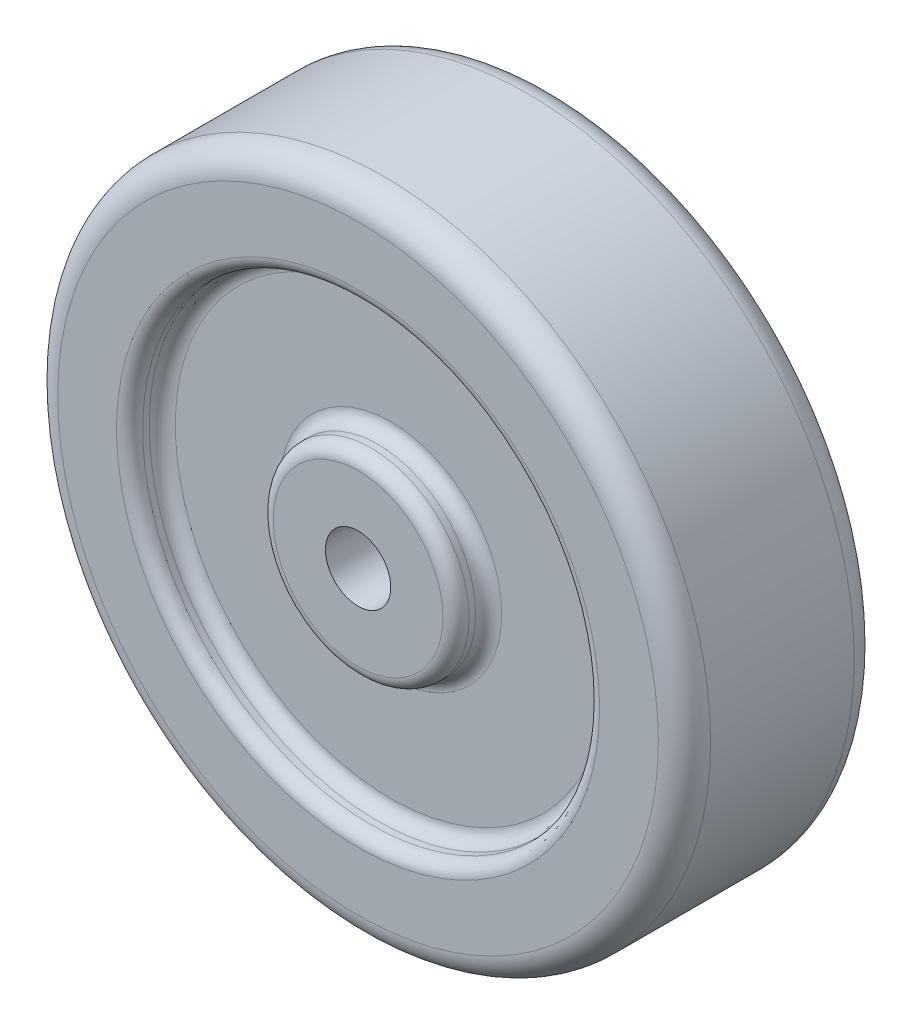
ISO-10303-21;
HEADER;
FILE_DESCRIPTION(('STEP AP214'),'2;1');
FILE_NAME('part.step','',(''),(''),'','','');
FILE_SCHEMA(('AUTOMOTIVE_DESIGN { 1 0 10303 214 1 1 1 1 }'));
ENDSEC;
DATA;
#1=APPLICATION_CONTEXT('core data for automotive mechanical design processes');
#2=APPLICATION_PROTOCOL_DEFINITION('international standard','automotive_design',2000,#1);
#3=PRODUCT_CONTEXT('',#1,'mechanical');
#4=PRODUCT('Part','Part','',(#3));
#5=PRODUCT_RELATED_PRODUCT_CATEGORY('part','',(#4));
#6=PRODUCT_DEFINITION_FORMATION('','',#4);
#7=PRODUCT_DEFINITION_CONTEXT('part definition',#1,'design');
#8=PRODUCT_DEFINITION('design','',#6,#7);
#9=PRODUCT_DEFINITION_SHAPE('','',#8);
#10=(LENGTH_UNIT() NAMED_UNIT(*) SI_UNIT(.MILLI.,.METRE.));
#11=(NAMED_UNIT(*) PLANE_ANGLE_UNIT() SI_UNIT($,.RADIAN.));
#12=(NAMED_UNIT(*) SI_UNIT($,.STERADIAN.) SOLID_ANGLE_UNIT());
#13=UNCERTAINTY_MEASURE_WITH_UNIT(LENGTH_MEASURE(1.E-05),#10,'distance_accuracy_value','');
#14=(GEOMETRIC_REPRESENTATION_CONTEXT(3) GLOBAL_UNCERTAINTY_ASSIGNED_CONTEXT((#13)) GLOBAL_UNIT_ASSIGNED_CONTEXT((#10,
#11,#12)) REPRESENTATION_CONTEXT('',''));
#15=CARTESIAN_POINT('',(0.,0.,0.));
#16=DIRECTION('',(0.,0.,1.));
#17=DIRECTION('',(1.,0.,0.));
#18=AXIS2_PLACEMENT_3D('',#15,#16,#17);
#19=CARTESIAN_POINT('',(0.,0.,9.525));
#20=DIRECTION('',(0.,0.,-1.));
#21=DIRECTION('',(-1.,0.,0.));
#22=AXIS2_PLACEMENT_3D('',#19,#20,#21);
#23=CYLINDRICAL_SURFACE('',#22,31.75);
#24=CARTESIAN_POINT('',(0.,0.,6.985));
#25=DIRECTION('',(0.,0.,1.));
#26=DIRECTION('',(1.,0.,0.));
#27=AXIS2_PLACEMENT_3D('',#24,#25,#26);
#28=CIRCLE('',#27,31.75);
#29=CARTESIAN_POINT('',(-31.75,0.,6.985));
#30=VERTEX_POINT('',#29);
#31=EDGE_CURVE('E64',#30,#30,#28,.F.);
#32=CARTESIAN_POINT('',(0.,0.,-6.985));
#33=DIRECTION('',(0.,0.,1.));
#34=DIRECTION('',(1.,0.,0.));
#35=AXIS2_PLACEMENT_3D('',#32,#33,#34);
#36=CIRCLE('',#35,31.75);
#37=CARTESIAN_POINT('',(-31.75,0.,-6.985));
#38=VERTEX_POINT('',#37);
#39=EDGE_CURVE('E94',#38,#38,#36,.F.);
#40=CARTESIAN_POINT('',(-31.75,0.,6.985));
#41=CARTESIAN_POINT('',(-31.75,0.,6.83947916666667));
#42=CARTESIAN_POINT('',(-31.75,0.,6.69395833333333));
#43=CARTESIAN_POINT('',(-31.75,0.,6.40291666666667));
#44=CARTESIAN_POINT('',(-31.75,0.,6.25739583333333));
#45=CARTESIAN_POINT('',(-31.75,0.,5.96635416666667));
#46=CARTESIAN_POINT('',(-31.75,0.,5.82083333333333));
#47=CARTESIAN_POINT('',(-31.75,0.,5.52979166666667));
#48=CARTESIAN_POINT('',(-31.75,0.,5.38427083333333));
#49=CARTESIAN_POINT('',(-31.75,0.,5.09322916666667));
#50=CARTESIAN_POINT('',(-31.75,0.,4.94770833333333));
#51=CARTESIAN_POINT('',(-31.75,0.,4.65666666666667));
#52=CARTESIAN_POINT('',(-31.75,0.,4.51114583333333));
#53=CARTESIAN_POINT('',(-31.75,0.,4.22010416666667));
#54=CARTESIAN_POINT('',(-31.75,0.,4.07458333333333));
#55=CARTESIAN_POINT('',(-31.75,0.,3.78354166666667));
#56=CARTESIAN_POINT('',(-31.75,0.,3.63802083333333));
#57=CARTESIAN_POINT('',(-31.75,0.,3.34697916666667));
#58=CARTESIAN_POINT('',(-31.75,0.,3.20145833333333));
#59=CARTESIAN_POINT('',(-31.75,0.,2.91041666666667));
#60=CARTESIAN_POINT('',(-31.75,0.,2.76489583333333));
#61=CARTESIAN_POINT('',(-31.75,0.,2.47385416666667));
#62=CARTESIAN_POINT('',(-31.75,0.,2.32833333333333));
#63=CARTESIAN_POINT('',(-31.75,0.,2.03729166666667));
#64=CARTESIAN_POINT('',(-31.75,0.,1.89177083333333));
#65=CARTESIAN_POINT('',(-31.75,0.,1.60072916666667));
#66=CARTESIAN_POINT('',(-31.75,0.,1.45520833333333));
#67=CARTESIAN_POINT('',(-31.75,0.,1.16416666666667));
#68=CARTESIAN_POINT('',(-31.75,0.,1.01864583333333));
#69=CARTESIAN_POINT('',(-31.75,0.,0.727604166666666));
#70=CARTESIAN_POINT('',(-31.75,0.,0.582083333333333));
#71=CARTESIAN_POINT('',(-31.75,0.,0.291041666666666));
#72=CARTESIAN_POINT('',(-31.75,0.,0.145520833333333));
#73=CARTESIAN_POINT('',(-31.75,0.,-0.145520833333334));
#74=CARTESIAN_POINT('',(-31.75,0.,-0.291041666666667));
#75=CARTESIAN_POINT('',(-31.75,0.,-0.582083333333335));
#76=CARTESIAN_POINT('',(-31.75,0.,-0.727604166666669));
#77=CARTESIAN_POINT('',(-31.75,0.,-1.01864583333334));
#78=CARTESIAN_POINT('',(-31.75,0.,-1.16416666666667));
#79=CARTESIAN_POINT('',(-31.75,0.,-1.45520833333333));
#80=CARTESIAN_POINT('',(-31.75,0.,-1.60072916666667));
#81=CARTESIAN_POINT('',(-31.75,0.,-1.89177083333334));
#82=CARTESIAN_POINT('',(-31.75,0.,-2.03729166666667));
#83=CARTESIAN_POINT('',(-31.75,0.,-2.32833333333333));
#84=CARTESIAN_POINT('',(-31.75,0.,-2.47385416666667));
#85=CARTESIAN_POINT('',(-31.75,0.,-2.76489583333333));
#86=CARTESIAN_POINT('',(-31.75,0.,-2.91041666666667));
#87=CARTESIAN_POINT('',(-31.75,0.,-3.20145833333334));
#88=CARTESIAN_POINT('',(-31.75,0.,-3.34697916666667));
#89=CARTESIAN_POINT('',(-31.75,0.,-3.63802083333334));
#90=CARTESIAN_POINT('',(-31.75,0.,-3.78354166666667));
#91=CARTESIAN_POINT('',(-31.75,0.,-4.07458333333333));
#92=CARTESIAN_POINT('',(-31.75,0.,-4.22010416666667));
#93=CARTESIAN_POINT('',(-31.75,0.,-4.51114583333333));
#94=CARTESIAN_POINT('',(-31.75,0.,-4.65666666666667));
#95=CARTESIAN_POINT('',(-31.75,0.,-4.94770833333334));
#96=CARTESIAN_POINT('',(-31.75,0.,-5.09322916666667));
#97=CARTESIAN_POINT('',(-31.75,0.,-5.38427083333333));
#98=CARTESIAN_POINT('',(-31.75,0.,-5.52979166666667));
#99=CARTESIAN_POINT('',(-31.75,0.,-5.82083333333333));
#100=CARTESIAN_POINT('',(-31.75,0.,-5.96635416666667));
#101=CARTESIAN_POINT('',(-31.75,0.,-6.25739583333333));
#102=CARTESIAN_POINT('',(-31.75,0.,-6.40291666666667));
#103=CARTESIAN_POINT('',(-31.75,0.,-6.69395833333333));
#104=CARTESIAN_POINT('',(-31.75,0.,-6.83947916666667));
#105=CARTESIAN_POINT('',(-31.75,0.,-6.985));
#106=B_SPLINE_CURVE_WITH_KNOTS('',3,(#40,#41,#42,#43,#44,#45,#46,#47,#48,#49,#50,#51,#52,#53,
#54,#55,#56,#57,#58,#59,#60,#61,#62,#63,#64,#65,#66,#67,#68,#69,#70,#71,#72,#73,#74,#75,#76,#77,
#78,#79,#80,#81,#82,#83,#84,#85,#86,#87,#88,#89,#90,#91,#92,#93,#94,#95,#96,#97,#98,#99,#100,
#101,#102,#103,#104,#105),.UNSPECIFIED.,.F.,.F.,(4,2,2,2,2,2,2,2,2,2,2,2,2,2,2,2,2,2,2,2,2,2,2,
2,2,2,2,2,2,2,2,2,4),(0.,0.436562500000001,0.873125000000001,1.3096875,1.74625,2.1828125,
2.619375,3.0559375,3.4925,3.9290625,4.365625,4.8021875,5.23875,5.6753125,6.111875,6.5484375,
6.985,7.4215625,7.858125,8.2946875,8.73125,9.1678125,9.604375,10.0409375,10.4775,10.9140625,
11.350625,11.7871875,12.22375,12.6603125,13.096875,13.5334375,13.97),.UNSPECIFIED.);
#107=EDGE_CURVE('BSEAM32',#30,#38,#106,.T.);
#108=ORIENTED_EDGE('',*,*,#31,.T.);
#109=ORIENTED_EDGE('',*,*,#39,.F.);
#110=ORIENTED_EDGE('',*,*,#107,.T.);
#111=ORIENTED_EDGE('',*,*,#107,.F.);
#112=EDGE_LOOP('',(#108,#110,#109,#111));
#113=FACE_BOUND('',#112,.T.);
#114=ADVANCED_FACE('F32',(#113),#23,.T.);
#115=CARTESIAN_POINT('',(0.,0.,9.525));
#116=DIRECTION('',(0.,0.,1.));
#117=DIRECTION('',(1.,0.,0.));
#118=AXIS2_PLACEMENT_3D('',#115,#116,#117);
#119=PLANE('',#118);
#120=CARTESIAN_POINT('',(0.,0.,9.525));
#121=DIRECTION('',(0.,0.,1.));
#122=DIRECTION('',(1.,0.,0.));
#123=AXIS2_PLACEMENT_3D('',#120,#121,#122);
#124=CIRCLE('',#123,23.495);
#125=CARTESIAN_POINT('',(23.495,0.,9.525));
#126=VERTEX_POINT('',#125);
#127=EDGE_CURVE('E10',#126,#126,#124,.F.);
#128=ORIENTED_EDGE('',*,*,#127,.T.);
#129=EDGE_LOOP('',(#128));
#130=FACE_BOUND('',#129,.T.);
#131=CARTESIAN_POINT('',(0.,0.,9.525));
#132=DIRECTION('',(0.,0.,1.));
#133=DIRECTION('',(1.,0.,0.));
#134=AXIS2_PLACEMENT_3D('',#131,#132,#133);
#135=CIRCLE('',#134,29.21);
#136=CARTESIAN_POINT('',(29.21,0.,9.525));
#137=VERTEX_POINT('',#136);
#138=EDGE_CURVE('E67',#137,#137,#135,.T.);
#139=ORIENTED_EDGE('',*,*,#138,.T.);
#140=EDGE_LOOP('',(#139));
#141=FACE_BOUND('',#140,.T.);
#142=ADVANCED_FACE('F123',(#130,#141),#119,.T.);
#143=CARTESIAN_POINT('',(0.,0.,6.985));
#144=DIRECTION('',(0.,0.,1.));
#145=DIRECTION('',(1.,0.,0.));
#146=AXIS2_PLACEMENT_3D('',#143,#144,#145);
#147=TOROIDAL_SURFACE('',#146,29.21,2.54);
#148=ORIENTED_EDGE('',*,*,#31,.F.);
#149=EDGE_LOOP('',(#148));
#150=FACE_BOUND('',#149,.T.);
#151=ORIENTED_EDGE('',*,*,#138,.F.);
#152=EDGE_LOOP('',(#151));
#153=FACE_BOUND('',#152,.T.);
#154=ADVANCED_FACE('F145',(#150,#153),#147,.T.);
#155=CARTESIAN_POINT('',(0.,0.,6.35));
#156=DIRECTION('',(0.,0.,1.));
#157=DIRECTION('',(1.,0.,0.));
#158=AXIS2_PLACEMENT_3D('',#155,#156,#157);
#159=CYLINDRICAL_SURFACE('',#158,22.225);
#160=CARTESIAN_POINT('',(0.,0.,7.62));
#161=DIRECTION('',(0.,0.,1.));
#162=DIRECTION('',(1.,0.,0.));
#163=AXIS2_PLACEMENT_3D('',#160,#161,#162);
#164=CIRCLE('',#163,22.225);
#165=CARTESIAN_POINT('',(22.225,0.,7.62));
#166=VERTEX_POINT('',#165);
#167=EDGE_CURVE('E39',#166,#166,#164,.F.);
#168=ORIENTED_EDGE('',*,*,#167,.T.);
#169=EDGE_LOOP('',(#168));
#170=FACE_BOUND('',#169,.T.);
#171=CARTESIAN_POINT('',(0.,0.,8.255));
#172=DIRECTION('',(0.,0.,1.));
#173=DIRECTION('',(1.,0.,0.));
#174=AXIS2_PLACEMENT_3D('',#171,#172,#173);
#175=CIRCLE('',#174,22.225);
#176=CARTESIAN_POINT('',(22.225,0.,8.255));
#177=VERTEX_POINT('',#176);
#178=EDGE_CURVE('E43',#177,#177,#175,.T.);
#179=ORIENTED_EDGE('',*,*,#178,.T.);
#180=EDGE_LOOP('',(#179));
#181=FACE_BOUND('',#180,.T.);
#182=ADVANCED_FACE('F150',(#170,#181),#159,.F.);
#183=CARTESIAN_POINT('',(0.,0.,6.35));
#184=DIRECTION('',(0.,0.,1.));
#185=DIRECTION('',(1.,0.,0.));
#186=AXIS2_PLACEMENT_3D('',#183,#184,#185);
#187=PLANE('',#186);
#188=CARTESIAN_POINT('',(0.,0.,6.35));
#189=DIRECTION('',(0.,0.,1.));
#190=DIRECTION('',(1.,0.,0.));
#191=AXIS2_PLACEMENT_3D('',#188,#189,#190);
#192=CIRCLE('',#191,10.795);
#193=CARTESIAN_POINT('',(10.795,0.,6.35));
#194=VERTEX_POINT('',#193);
#195=EDGE_CURVE('E52',#194,#194,#192,.F.);
#196=ORIENTED_EDGE('',*,*,#195,.T.);
#197=EDGE_LOOP('',(#196));
#198=FACE_BOUND('',#197,.T.);
#199=CARTESIAN_POINT('',(0.,0.,6.35));
#200=DIRECTION('',(0.,0.,1.));
#201=DIRECTION('',(1.,0.,0.));
#202=AXIS2_PLACEMENT_3D('',#199,#200,#201);
#203=CIRCLE('',#202,20.955);
#204=CARTESIAN_POINT('',(20.955,0.,6.35));
#205=VERTEX_POINT('',#204);
#206=EDGE_CURVE('E55',#205,#205,#203,.T.);
#207=ORIENTED_EDGE('',*,*,#206,.T.);
#208=EDGE_LOOP('',(#207));
#209=FACE_BOUND('',#208,.T.);
#210=ADVANCED_FACE('F155',(#198,#209),#187,.T.);
#211=CARTESIAN_POINT('',(0.,0.,6.35));
#212=DIRECTION('',(0.,0.,1.));
#213=DIRECTION('',(1.,0.,0.));
#214=AXIS2_PLACEMENT_3D('',#211,#212,#213);
#215=CYLINDRICAL_SURFACE('',#214,9.525);
#216=CARTESIAN_POINT('',(0.,0.,7.62));
#217=DIRECTION('',(0.,0.,1.));
#218=DIRECTION('',(1.,0.,0.));
#219=AXIS2_PLACEMENT_3D('',#216,#217,#218);
#220=CIRCLE('',#219,9.525);
#221=CARTESIAN_POINT('',(9.525,0.,7.62));
#222=VERTEX_POINT('',#221);
#223=EDGE_CURVE('E58',#222,#222,#220,.T.);
#224=ORIENTED_EDGE('',*,*,#223,.T.);
#225=EDGE_LOOP('',(#224));
#226=FACE_BOUND('',#225,.T.);
#227=CARTESIAN_POINT('',(0.,0.,8.255));
#228=DIRECTION('',(0.,0.,1.));
#229=DIRECTION('',(1.,0.,0.));
#230=AXIS2_PLACEMENT_3D('',#227,#228,#229);
#231=CIRCLE('',#230,9.525);
#232=CARTESIAN_POINT('',(9.525,0.,8.255));
#233=VERTEX_POINT('',#232);
#234=EDGE_CURVE('E61',#233,#233,#231,.F.);
#235=ORIENTED_EDGE('',*,*,#234,.T.);
#236=EDGE_LOOP('',(#235));
#237=FACE_BOUND('',#236,.T.);
#238=ADVANCED_FACE('F121',(#226,#237),#215,.T.);
#239=CARTESIAN_POINT('',(0.,0.,9.525));
#240=DIRECTION('',(0.,0.,1.));
#241=DIRECTION('',(1.,0.,0.));
#242=AXIS2_PLACEMENT_3D('',#239,#240,#241);
#243=CIRCLE('',#242,3.175);
#244=CARTESIAN_POINT('',(3.175,0.,9.525));
#245=VERTEX_POINT('',#244);
#246=EDGE_CURVE('E101',#245,#245,#243,.T.);
#247=ORIENTED_EDGE('',*,*,#246,.F.);
#248=EDGE_LOOP('',(#247));
#249=FACE_BOUND('',#248,.T.);
#250=CARTESIAN_POINT('',(0.,0.,9.525));
#251=DIRECTION('',(0.,0.,1.));
#252=DIRECTION('',(1.,0.,0.));
#253=AXIS2_PLACEMENT_3D('',#250,#251,#252);
#254=CIRCLE('',#253,8.255);
#255=CARTESIAN_POINT('',(8.255,0.,9.525));
#256=VERTEX_POINT('',#255);
#257=EDGE_CURVE('E47',#256,#256,#254,.T.);
#258=ORIENTED_EDGE('',*,*,#257,.T.);
#259=EDGE_LOOP('',(#258));
#260=FACE_BOUND('',#259,.T.);
#261=ADVANCED_FACE('F117',(#249,#260),#119,.T.);
#262=CARTESIAN_POINT('',(0.,0.,7.62));
#263=DIRECTION('',(0.,0.,1.));
#264=DIRECTION('',(1.,0.,0.));
#265=AXIS2_PLACEMENT_3D('',#262,#263,#264);
#266=TOROIDAL_SURFACE('',#265,10.795,1.27);
#267=ORIENTED_EDGE('',*,*,#195,.F.);
#268=EDGE_LOOP('',(#267));
#269=FACE_BOUND('',#268,.T.);
#270=ORIENTED_EDGE('',*,*,#223,.F.);
#271=EDGE_LOOP('',(#270));
#272=FACE_BOUND('',#271,.T.);
#273=ADVANCED_FACE('F120',(#269,#272),#266,.F.);
#274=CARTESIAN_POINT('',(0.,0.,8.255));
#275=DIRECTION('',(0.,0.,1.));
#276=DIRECTION('',(1.,0.,0.));
#277=AXIS2_PLACEMENT_3D('',#274,#275,#276);
#278=TOROIDAL_SURFACE('',#277,8.255,1.27);
#279=ORIENTED_EDGE('',*,*,#234,.F.);
#280=EDGE_LOOP('',(#279));
#281=FACE_BOUND('',#280,.T.);
#282=ORIENTED_EDGE('',*,*,#257,.F.);
#283=EDGE_LOOP('',(#282));
#284=FACE_BOUND('',#283,.T.);
#285=ADVANCED_FACE('F126',(#281,#284),#278,.T.);
#286=CARTESIAN_POINT('',(0.,0.,7.62));
#287=DIRECTION('',(0.,0.,1.));
#288=DIRECTION('',(1.,0.,0.));
#289=AXIS2_PLACEMENT_3D('',#286,#287,#288);
#290=TOROIDAL_SURFACE('',#289,20.955,1.27);
#291=ORIENTED_EDGE('',*,*,#167,.F.);
#292=EDGE_LOOP('',(#291));
#293=FACE_BOUND('',#292,.T.);
#294=ORIENTED_EDGE('',*,*,#206,.F.);
#295=EDGE_LOOP('',(#294));
#296=FACE_BOUND('',#295,.T.);
#297=ADVANCED_FACE('F128',(#293,#296),#290,.F.);
#298=CARTESIAN_POINT('',(0.,0.,8.255));
#299=DIRECTION('',(0.,0.,1.));
#300=DIRECTION('',(1.,0.,0.));
#301=AXIS2_PLACEMENT_3D('',#298,#299,#300);
#302=TOROIDAL_SURFACE('',#301,23.495,1.27);
#303=ORIENTED_EDGE('',*,*,#127,.F.);
#304=EDGE_LOOP('',(#303));
#305=FACE_BOUND('',#304,.T.);
#306=ORIENTED_EDGE('',*,*,#178,.F.);
#307=EDGE_LOOP('',(#306));
#308=FACE_BOUND('',#307,.T.);
#309=ADVANCED_FACE('F34',(#305,#308),#302,.T.);
#310=CARTESIAN_POINT('',(0.,0.,-9.525));
#311=DIRECTION('',(0.,0.,-1.));
#312=DIRECTION('',(1.,0.,0.));
#313=AXIS2_PLACEMENT_3D('',#310,#311,#312);
#314=PLANE('',#313);
#315=CARTESIAN_POINT('',(0.,0.,-9.525));
#316=DIRECTION('',(0.,0.,1.));
#317=DIRECTION('',(1.,0.,0.));
#318=AXIS2_PLACEMENT_3D('',#315,#316,#317);
#319=CIRCLE('',#318,23.495);
#320=CARTESIAN_POINT('',(23.495,0.,-9.525));
#321=VERTEX_POINT('',#320);
#322=EDGE_CURVE('E70',#321,#321,#319,.F.);
#323=ORIENTED_EDGE('',*,*,#322,.F.);
#324=EDGE_LOOP('',(#323));
#325=FACE_BOUND('',#324,.T.);
#326=CARTESIAN_POINT('',(0.,0.,-9.525));
#327=DIRECTION('',(0.,0.,1.));
#328=DIRECTION('',(1.,0.,0.));
#329=AXIS2_PLACEMENT_3D('',#326,#327,#328);
#330=CIRCLE('',#329,29.21);
#331=CARTESIAN_POINT('',(29.21,0.,-9.525));
#332=VERTEX_POINT('',#331);
#333=EDGE_CURVE('E97',#332,#332,#330,.T.);
#334=ORIENTED_EDGE('',*,*,#333,.F.);
#335=EDGE_LOOP('',(#334));
#336=FACE_BOUND('',#335,.T.);
#337=ADVANCED_FACE('F189',(#325,#336),#314,.T.);
#338=CARTESIAN_POINT('',(0.,0.,-6.985));
#339=DIRECTION('',(0.,0.,-1.));
#340=DIRECTION('',(1.,0.,0.));
#341=AXIS2_PLACEMENT_3D('',#338,#339,#340);
#342=TOROIDAL_SURFACE('',#341,29.21,2.54);
#343=ORIENTED_EDGE('',*,*,#39,.T.);
#344=EDGE_LOOP('',(#343));
#345=FACE_BOUND('',#344,.T.);
#346=ORIENTED_EDGE('',*,*,#333,.T.);
#347=EDGE_LOOP('',(#346));
#348=FACE_BOUND('',#347,.T.);
#349=ADVANCED_FACE('F185',(#345,#348),#342,.T.);
#350=CARTESIAN_POINT('',(0.,0.,-6.35));
#351=DIRECTION('',(0.,0.,-1.));
#352=DIRECTION('',(1.,0.,0.));
#353=AXIS2_PLACEMENT_3D('',#350,#351,#352);
#354=CYLINDRICAL_SURFACE('',#353,22.225);
#355=CARTESIAN_POINT('',(0.,0.,-7.62));
#356=DIRECTION('',(0.,0.,1.));
#357=DIRECTION('',(1.,0.,0.));
#358=AXIS2_PLACEMENT_3D('',#355,#356,#357);
#359=CIRCLE('',#358,22.225);
#360=CARTESIAN_POINT('',(22.225,0.,-7.62));
#361=VERTEX_POINT('',#360);
#362=EDGE_CURVE('E73',#361,#361,#359,.F.);
#363=ORIENTED_EDGE('',*,*,#362,.F.);
#364=EDGE_LOOP('',(#363));
#365=FACE_BOUND('',#364,.T.);
#366=CARTESIAN_POINT('',(0.,0.,-8.255));
#367=DIRECTION('',(0.,0.,1.));
#368=DIRECTION('',(1.,0.,0.));
#369=AXIS2_PLACEMENT_3D('',#366,#367,#368);
#370=CIRCLE('',#369,22.225);
#371=CARTESIAN_POINT('',(22.225,0.,-8.255));
#372=VERTEX_POINT('',#371);
#373=EDGE_CURVE('E76',#372,#372,#370,.T.);
#374=ORIENTED_EDGE('',*,*,#373,.F.);
#375=EDGE_LOOP('',(#374));
#376=FACE_BOUND('',#375,.T.);
#377=ADVANCED_FACE('F188',(#365,#376),#354,.F.);
#378=CARTESIAN_POINT('',(0.,0.,-6.35));
#379=DIRECTION('',(0.,0.,-1.));
#380=DIRECTION('',(1.,0.,0.));
#381=AXIS2_PLACEMENT_3D('',#378,#379,#380);
#382=PLANE('',#381);
#383=CARTESIAN_POINT('',(0.,0.,-6.35));
#384=DIRECTION('',(0.,0.,1.));
#385=DIRECTION('',(1.,0.,0.));
#386=AXIS2_PLACEMENT_3D('',#383,#384,#385);
#387=CIRCLE('',#386,10.795);
#388=CARTESIAN_POINT('',(10.795,0.,-6.35));
#389=VERTEX_POINT('',#388);
#390=EDGE_CURVE('E82',#389,#389,#387,.F.);
#391=ORIENTED_EDGE('',*,*,#390,.F.);
#392=EDGE_LOOP('',(#391));
#393=FACE_BOUND('',#392,.T.);
#394=CARTESIAN_POINT('',(0.,0.,-6.35));
#395=DIRECTION('',(0.,0.,1.));
#396=DIRECTION('',(1.,0.,0.));
#397=AXIS2_PLACEMENT_3D('',#394,#395,#396);
#398=CIRCLE('',#397,20.955);
#399=CARTESIAN_POINT('',(20.955,0.,-6.35));
#400=VERTEX_POINT('',#399);
#401=EDGE_CURVE('E85',#400,#400,#398,.T.);
#402=ORIENTED_EDGE('',*,*,#401,.F.);
#403=EDGE_LOOP('',(#402));
#404=FACE_BOUND('',#403,.T.);
#405=ADVANCED_FACE('F196',(#393,#404),#382,.T.);
#406=CARTESIAN_POINT('',(0.,0.,-6.35));
#407=DIRECTION('',(0.,0.,-1.));
#408=DIRECTION('',(1.,0.,0.));
#409=AXIS2_PLACEMENT_3D('',#406,#407,#408);
#410=CYLINDRICAL_SURFACE('',#409,9.525);
#411=CARTESIAN_POINT('',(0.,0.,-7.62));
#412=DIRECTION('',(0.,0.,1.));
#413=DIRECTION('',(1.,0.,0.));
#414=AXIS2_PLACEMENT_3D('',#411,#412,#413);
#415=CIRCLE('',#414,9.525);
#416=CARTESIAN_POINT('',(9.525,0.,-7.62));
#417=VERTEX_POINT('',#416);
#418=EDGE_CURVE('E88',#417,#417,#415,.T.);
#419=ORIENTED_EDGE('',*,*,#418,.F.);
#420=EDGE_LOOP('',(#419));
#421=FACE_BOUND('',#420,.T.);
#422=CARTESIAN_POINT('',(0.,0.,-8.255));
#423=DIRECTION('',(0.,0.,1.));
#424=DIRECTION('',(1.,0.,0.));
#425=AXIS2_PLACEMENT_3D('',#422,#423,#424);
#426=CIRCLE('',#425,9.525);
#427=CARTESIAN_POINT('',(9.525,0.,-8.255));
#428=VERTEX_POINT('',#427);
#429=EDGE_CURVE('E91',#428,#428,#426,.F.);
#430=ORIENTED_EDGE('',*,*,#429,.F.);
#431=EDGE_LOOP('',(#430));
#432=FACE_BOUND('',#431,.T.);
#433=ADVANCED_FACE('F200',(#421,#432),#410,.T.);
#434=CARTESIAN_POINT('',(0.,0.,-9.525));
#435=DIRECTION('',(0.,0.,1.));
#436=DIRECTION('',(1.,0.,0.));
#437=AXIS2_PLACEMENT_3D('',#434,#435,#436);
#438=CIRCLE('',#437,3.175);
#439=CARTESIAN_POINT('',(3.175,0.,-9.525));
#440=VERTEX_POINT('',#439);
#441=EDGE_CURVE('E100',#440,#440,#438,.T.);
#442=ORIENTED_EDGE('',*,*,#441,.T.);
#443=EDGE_LOOP('',(#442));
#444=FACE_BOUND('',#443,.T.);
#445=CARTESIAN_POINT('',(0.,0.,-9.525));
#446=DIRECTION('',(0.,0.,1.));
#447=DIRECTION('',(1.,0.,0.));
#448=AXIS2_PLACEMENT_3D('',#445,#446,#447);
#449=CIRCLE('',#448,8.255);
#450=CARTESIAN_POINT('',(8.255,0.,-9.525));
#451=VERTEX_POINT('',#450);
#452=EDGE_CURVE('E79',#451,#451,#449,.T.);
#453=ORIENTED_EDGE('',*,*,#452,.F.);
#454=EDGE_LOOP('',(#453));
#455=FACE_BOUND('',#454,.T.);
#456=ADVANCED_FACE('F107',(#444,#455),#314,.T.);
#457=CARTESIAN_POINT('',(0.,0.,-7.62));
#458=DIRECTION('',(0.,0.,-1.));
#459=DIRECTION('',(1.,0.,0.));
#460=AXIS2_PLACEMENT_3D('',#457,#458,#459);
#461=TOROIDAL_SURFACE('',#460,10.795,1.27);
#462=ORIENTED_EDGE('',*,*,#390,.T.);
#463=EDGE_LOOP('',(#462));
#464=FACE_BOUND('',#463,.T.);
#465=ORIENTED_EDGE('',*,*,#418,.T.);
#466=EDGE_LOOP('',(#465));
#467=FACE_BOUND('',#466,.T.);
#468=ADVANCED_FACE('F180',(#464,#467),#461,.F.);
#469=CARTESIAN_POINT('',(0.,0.,-8.255));
#470=DIRECTION('',(0.,0.,-1.));
#471=DIRECTION('',(1.,0.,0.));
#472=AXIS2_PLACEMENT_3D('',#469,#470,#471);
#473=TOROIDAL_SURFACE('',#472,8.255,1.27);
#474=ORIENTED_EDGE('',*,*,#429,.T.);
#475=EDGE_LOOP('',(#474));
#476=FACE_BOUND('',#475,.T.);
#477=ORIENTED_EDGE('',*,*,#452,.T.);
#478=EDGE_LOOP('',(#477));
#479=FACE_BOUND('',#478,.T.);
#480=ADVANCED_FACE('F176',(#476,#479),#473,.T.);
#481=CARTESIAN_POINT('',(0.,0.,-7.62));
#482=DIRECTION('',(0.,0.,-1.));
#483=DIRECTION('',(1.,0.,0.));
#484=AXIS2_PLACEMENT_3D('',#481,#482,#483);
#485=TOROIDAL_SURFACE('',#484,20.955,1.27);
#486=ORIENTED_EDGE('',*,*,#362,.T.);
#487=EDGE_LOOP('',(#486));
#488=FACE_BOUND('',#487,.T.);
#489=ORIENTED_EDGE('',*,*,#401,.T.);
#490=EDGE_LOOP('',(#489));
#491=FACE_BOUND('',#490,.T.);
#492=ADVANCED_FACE('F172',(#488,#491),#485,.F.);
#493=CARTESIAN_POINT('',(0.,0.,-8.255));
#494=DIRECTION('',(0.,0.,-1.));
#495=DIRECTION('',(1.,0.,0.));
#496=AXIS2_PLACEMENT_3D('',#493,#494,#495);
#497=TOROIDAL_SURFACE('',#496,23.495,1.27);
#498=ORIENTED_EDGE('',*,*,#322,.T.);
#499=EDGE_LOOP('',(#498));
#500=FACE_BOUND('',#499,.T.);
#501=ORIENTED_EDGE('',*,*,#373,.T.);
#502=EDGE_LOOP('',(#501));
#503=FACE_BOUND('',#502,.T.);
#504=ADVANCED_FACE('F113',(#500,#503),#497,.T.);
#505=CARTESIAN_POINT('',(0.,0.,-9.525));
#506=DIRECTION('',(0.,0.,1.));
#507=DIRECTION('',(1.,0.,0.));
#508=AXIS2_PLACEMENT_3D('',#505,#506,#507);
#509=CYLINDRICAL_SURFACE('',#508,3.175);
#510=CARTESIAN_POINT('',(3.175,0.,-9.525));
#511=CARTESIAN_POINT('',(3.175,0.,-9.3265625));
#512=CARTESIAN_POINT('',(3.175,0.,-9.128125));
#513=CARTESIAN_POINT('',(3.175,0.,-8.73125));
#514=CARTESIAN_POINT('',(3.175,0.,-8.5328125));
#515=CARTESIAN_POINT('',(3.175,0.,-8.1359375));
#516=CARTESIAN_POINT('',(3.175,0.,-7.9375));
#517=CARTESIAN_POINT('',(3.175,0.,-7.540625));
#518=CARTESIAN_POINT('',(3.175,0.,-7.3421875));
#519=CARTESIAN_POINT('',(3.175,0.,-6.9453125));
#520=CARTESIAN_POINT('',(3.175,0.,-6.746875));
#521=CARTESIAN_POINT('',(3.175,0.,-6.35));
#522=CARTESIAN_POINT('',(3.175,0.,-6.1515625));
#523=CARTESIAN_POINT('',(3.175,0.,-5.7546875));
#524=CARTESIAN_POINT('',(3.175,0.,-5.55625));
#525=CARTESIAN_POINT('',(3.175,0.,-5.159375));
#526=CARTESIAN_POINT('',(3.175,0.,-4.9609375));
#527=CARTESIAN_POINT('',(3.175,0.,-4.5640625));
#528=CARTESIAN_POINT('',(3.175,0.,-4.365625));
#529=CARTESIAN_POINT('',(3.175,0.,-3.96875));
#530=CARTESIAN_POINT('',(3.175,0.,-3.7703125));
#531=CARTESIAN_POINT('',(3.175,0.,-3.3734375));
#532=CARTESIAN_POINT('',(3.175,0.,-3.175));
#533=CARTESIAN_POINT('',(3.175,0.,-2.778125));
#534=CARTESIAN_POINT('',(3.175,0.,-2.5796875));
#535=CARTESIAN_POINT('',(3.175,0.,-2.1828125));
#536=CARTESIAN_POINT('',(3.175,0.,-1.984375));
#537=CARTESIAN_POINT('',(3.175,0.,-1.5875));
#538=CARTESIAN_POINT('',(3.175,0.,-1.3890625));
#539=CARTESIAN_POINT('',(3.175,0.,-0.992187500000002));
#540=CARTESIAN_POINT('',(3.175,0.,-0.793750000000002));
#541=CARTESIAN_POINT('',(3.175,0.,-0.396875000000002));
#542=CARTESIAN_POINT('',(3.175,0.,-0.198437500000002));
#543=CARTESIAN_POINT('',(3.175,0.,0.198437499999998));
#544=CARTESIAN_POINT('',(3.175,0.,0.396874999999998));
#545=CARTESIAN_POINT('',(3.175,0.,0.793749999999999));
#546=CARTESIAN_POINT('',(3.175,0.,0.992187499999999));
#547=CARTESIAN_POINT('',(3.175,0.,1.3890625));
#548=CARTESIAN_POINT('',(3.175,0.,1.5875));
#549=CARTESIAN_POINT('',(3.175,0.,1.984375));
#550=CARTESIAN_POINT('',(3.175,0.,2.1828125));
#551=CARTESIAN_POINT('',(3.175,0.,2.5796875));
#552=CARTESIAN_POINT('',(3.175,0.,2.778125));
#553=CARTESIAN_POINT('',(3.175,0.,3.175));
#554=CARTESIAN_POINT('',(3.175,0.,3.3734375));
#555=CARTESIAN_POINT('',(3.175,0.,3.7703125));
#556=CARTESIAN_POINT('',(3.175,0.,3.96875));
#557=CARTESIAN_POINT('',(3.175,0.,4.365625));
#558=CARTESIAN_POINT('',(3.175,0.,4.5640625));
#559=CARTESIAN_POINT('',(3.175,0.,4.9609375));
#560=CARTESIAN_POINT('',(3.175,0.,5.159375));
#561=CARTESIAN_POINT('',(3.175,0.,5.55625));
#562=CARTESIAN_POINT('',(3.175,0.,5.7546875));
#563=CARTESIAN_POINT('',(3.175,0.,6.1515625));
#564=CARTESIAN_POINT('',(3.175,0.,6.35));
#565=CARTESIAN_POINT('',(3.175,0.,6.746875));
#566=CARTESIAN_POINT('',(3.175,0.,6.9453125));
#567=CARTESIAN_POINT('',(3.175,0.,7.3421875));
#568=CARTESIAN_POINT('',(3.175,0.,7.540625));
#569=CARTESIAN_POINT('',(3.175,0.,7.9375));
#570=CARTESIAN_POINT('',(3.175,0.,8.1359375));
#571=CARTESIAN_POINT('',(3.175,0.,8.5328125));
#572=CARTESIAN_POINT('',(3.175,0.,8.73125));
#573=CARTESIAN_POINT('',(3.175,0.,9.128125));
#574=CARTESIAN_POINT('',(3.175,0.,9.3265625));
#575=CARTESIAN_POINT('',(3.175,0.,9.525));
#576=B_SPLINE_CURVE_WITH_KNOTS('',3,(#510,#511,#512,#513,#514,#515,#516,#517,#518,#519,#520,
#521,#522,#523,#524,#525,#526,#527,#528,#529,#530,#531,#532,#533,#534,#535,#536,#537,#538,#539,
#540,#541,#542,#543,#544,#545,#546,#547,#548,#549,#550,#551,#552,#553,#554,#555,#556,#557,#558,
#559,#560,#561,#562,#563,#564,#565,#566,#567,#568,#569,#570,#571,#572,#573,#574,#575),
.UNSPECIFIED.,.F.,.F.,(4,2,2,2,2,2,2,2,2,2,2,2,2,2,2,2,2,2,2,2,2,2,2,2,2,2,2,2,2,2,2,2,4),(0.,
0.5953125,1.190625,1.7859375,2.38125,2.9765625,3.571875,4.1671875,4.7625,5.3578125,5.953125,
6.5484375,7.14375,7.7390625,8.334375,8.9296875,9.525,10.1203125,10.715625,11.3109375,11.90625,
12.5015625,13.096875,13.6921875,14.2875,14.8828125,15.478125,16.0734375,16.66875,17.2640625,
17.859375,18.4546875,19.05),.UNSPECIFIED.);
#577=EDGE_CURVE('BSEAM110',#440,#245,#576,.T.);
#578=ORIENTED_EDGE('',*,*,#441,.F.);
#579=ORIENTED_EDGE('',*,*,#246,.T.);
#580=ORIENTED_EDGE('',*,*,#577,.T.);
#581=ORIENTED_EDGE('',*,*,#577,.F.);
#582=EDGE_LOOP('',(#578,#580,#579,#581));
#583=FACE_BOUND('',#582,.T.);
#584=ADVANCED_FACE('F110',(#583),#509,.F.);
#585=CLOSED_SHELL('',(#114,#142,#154,#182,#210,#238,#261,#273,#285,#297,#309,#337,#349,#377,
#405,#433,#456,#468,#480,#492,#504,#584));
#586=MANIFOLD_SOLID_BREP('B2',#585);
#587=ADVANCED_BREP_SHAPE_REPRESENTATION('',(#18,#586),#14);
#588=SHAPE_DEFINITION_REPRESENTATION(#9,#587);
ENDSEC;
END-ISO-10303-21;
